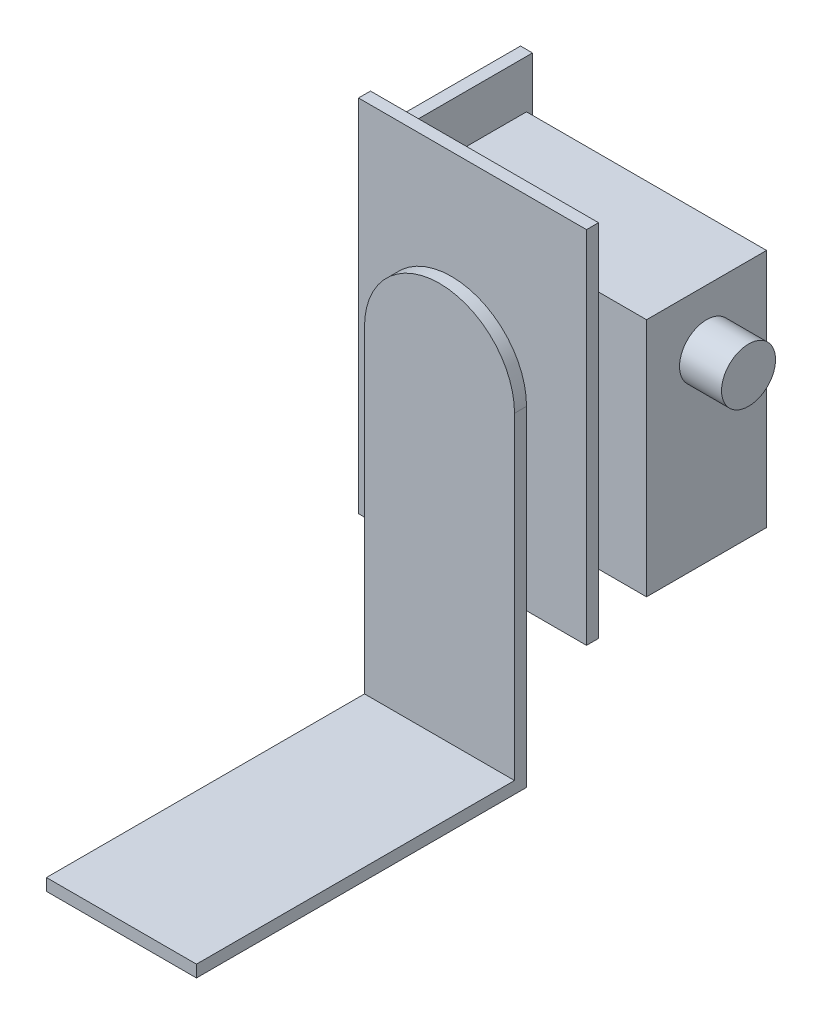
ISO-10303-21;
HEADER;
FILE_DESCRIPTION(('STEP AP214'),'2;1');
FILE_NAME('part.step','',(''),(''),'','','');
FILE_SCHEMA(('AUTOMOTIVE_DESIGN { 1 0 10303 214 1 1 1 1 }'));
ENDSEC;
DATA;
#1=APPLICATION_CONTEXT('core data for automotive mechanical design processes');
#2=APPLICATION_PROTOCOL_DEFINITION('international standard','automotive_design',2000,#1);
#3=PRODUCT_CONTEXT('',#1,'mechanical');
#4=PRODUCT('Part','Part','',(#3));
#5=PRODUCT_RELATED_PRODUCT_CATEGORY('part','',(#4));
#6=PRODUCT_DEFINITION_FORMATION('','',#4);
#7=PRODUCT_DEFINITION_CONTEXT('part definition',#1,'design');
#8=PRODUCT_DEFINITION('design','',#6,#7);
#9=PRODUCT_DEFINITION_SHAPE('','',#8);
#10=(LENGTH_UNIT() NAMED_UNIT(*) SI_UNIT(.MILLI.,.METRE.));
#11=(NAMED_UNIT(*) PLANE_ANGLE_UNIT() SI_UNIT($,.RADIAN.));
#12=(NAMED_UNIT(*) SI_UNIT($,.STERADIAN.) SOLID_ANGLE_UNIT());
#13=UNCERTAINTY_MEASURE_WITH_UNIT(LENGTH_MEASURE(1.E-05),#10,'distance_accuracy_value','');
#14=(GEOMETRIC_REPRESENTATION_CONTEXT(3) GLOBAL_UNCERTAINTY_ASSIGNED_CONTEXT((#13)) GLOBAL_UNIT_ASSIGNED_CONTEXT((#10,
#11,#12)) REPRESENTATION_CONTEXT('',''));
#15=CARTESIAN_POINT('',(0.,0.,0.));
#16=DIRECTION('',(0.,0.,1.));
#17=DIRECTION('',(1.,0.,0.));
#18=AXIS2_PLACEMENT_3D('',#15,#16,#17);
#19=CARTESIAN_POINT('',(0.,0.,-57.));
#20=DIRECTION('',(0.,0.,1.));
#21=DIRECTION('',(1.,0.,0.));
#22=AXIS2_PLACEMENT_3D('',#19,#20,#21);
#23=PLANE('',#22);
#24=DIRECTION('',(1.,0.,0.));
#25=VECTOR('',#24,1.);
#26=CARTESIAN_POINT('',(-2.99999999999998,79.5,-57.));
#27=LINE('',#26,#25);
#28=CARTESIAN_POINT('',(-2.99999999999998,79.5,-57.));
#29=VERTEX_POINT('',#28);
#30=CARTESIAN_POINT('',(-0.999999999999995,79.5,-57.));
#31=VERTEX_POINT('',#30);
#32=EDGE_CURVE('E435',#29,#31,#27,.T.);
#33=ORIENTED_EDGE('',*,*,#32,.F.);
#34=DIRECTION('',(0.,1.,0.));
#35=VECTOR('',#34,1.);
#36=CARTESIAN_POINT('',(-3.,25.5,-57.));
#37=LINE('',#36,#35);
#38=CARTESIAN_POINT('',(-3.,85.5,-57.));
#39=VERTEX_POINT('',#38);
#40=EDGE_CURVE('E190',#29,#39,#37,.T.);
#41=ORIENTED_EDGE('',*,*,#40,.T.);
#42=DIRECTION('',(1.,0.,0.));
#43=VECTOR('',#42,1.);
#44=CARTESIAN_POINT('',(35.,85.5,-57.));
#45=LINE('',#44,#43);
#46=CARTESIAN_POINT('',(35.,85.5,-57.));
#47=VERTEX_POINT('',#46);
#48=EDGE_CURVE('E240',#39,#47,#45,.T.);
#49=ORIENTED_EDGE('',*,*,#48,.T.);
#50=DIRECTION('',(0.,-1.,0.));
#51=VECTOR('',#50,1.);
#52=CARTESIAN_POINT('',(35.,25.5,-57.));
#53=LINE('',#52,#51);
#54=CARTESIAN_POINT('',(35.,75.5,-57.));
#55=VERTEX_POINT('',#54);
#56=EDGE_CURVE('E231',#47,#55,#53,.T.);
#57=ORIENTED_EDGE('',*,*,#56,.T.);
#58=DIRECTION('',(1.,0.,0.));
#59=VECTOR('',#58,1.);
#60=CARTESIAN_POINT('',(43.,75.5,-57.));
#61=LINE('',#60,#59);
#62=CARTESIAN_POINT('',(3.,75.5,-57.));
#63=VERTEX_POINT('',#62);
#64=EDGE_CURVE('E204',#63,#55,#61,.T.);
#65=ORIENTED_EDGE('',*,*,#64,.F.);
#66=DIRECTION('',(0.,1.,0.));
#67=VECTOR('',#66,1.);
#68=CARTESIAN_POINT('',(3.,35.5,-57.));
#69=LINE('',#68,#67);
#70=CARTESIAN_POINT('',(3.,35.5,-57.));
#71=VERTEX_POINT('',#70);
#72=EDGE_CURVE('E213',#71,#63,#69,.T.);
#73=ORIENTED_EDGE('',*,*,#72,.F.);
#74=DIRECTION('',(-1.,0.,0.));
#75=VECTOR('',#74,1.);
#76=CARTESIAN_POINT('',(43.,35.5,-57.));
#77=LINE('',#76,#75);
#78=CARTESIAN_POINT('',(35.,35.5,-57.));
#79=VERTEX_POINT('',#78);
#80=EDGE_CURVE('E40',#79,#71,#77,.T.);
#81=ORIENTED_EDGE('',*,*,#80,.F.);
#82=CARTESIAN_POINT('',(35.,25.5,-57.));
#83=VERTEX_POINT('',#82);
#84=EDGE_CURVE('E236',#79,#83,#53,.T.);
#85=ORIENTED_EDGE('',*,*,#84,.T.);
#86=DIRECTION('',(-1.,0.,0.));
#87=VECTOR('',#86,1.);
#88=CARTESIAN_POINT('',(35.,25.5,-57.));
#89=LINE('',#88,#87);
#90=CARTESIAN_POINT('',(-3.,25.5,-57.));
#91=VERTEX_POINT('',#90);
#92=EDGE_CURVE('E234',#83,#91,#89,.T.);
#93=ORIENTED_EDGE('',*,*,#92,.T.);
#94=CARTESIAN_POINT('',(-3.,39.5,-57.));
#95=VERTEX_POINT('',#94);
#96=EDGE_CURVE('E238',#91,#95,#37,.T.);
#97=ORIENTED_EDGE('',*,*,#96,.T.);
#98=DIRECTION('',(-1.,0.,0.));
#99=VECTOR('',#98,1.);
#100=CARTESIAN_POINT('',(-3.,39.5,-57.));
#101=LINE('',#100,#99);
#102=CARTESIAN_POINT('',(-0.999999999999995,39.5,-57.));
#103=VERTEX_POINT('',#102);
#104=EDGE_CURVE('E52',#103,#95,#101,.T.);
#105=ORIENTED_EDGE('',*,*,#104,.F.);
#106=DIRECTION('',(0.,-1.,0.));
#107=VECTOR('',#106,1.);
#108=CARTESIAN_POINT('',(-0.999999999999995,79.5,-57.));
#109=LINE('',#108,#107);
#110=EDGE_CURVE('E47',#31,#103,#109,.T.);
#111=ORIENTED_EDGE('',*,*,#110,.F.);
#112=EDGE_LOOP('',(#33,#41,#49,#57,#65,#73,#81,#85,#93,#97,#105,#111));
#113=FACE_BOUND('',#112,.T.);
#114=ADVANCED_FACE('F32',(#113),#23,.F.);
#115=CARTESIAN_POINT('',(0.,2.,-55.));
#116=DIRECTION('',(0.,0.,1.));
#117=DIRECTION('',(1.,0.,0.));
#118=AXIS2_PLACEMENT_3D('',#115,#116,#117);
#119=PLANE('',#118);
#120=DIRECTION('',(-1.,0.,0.));
#121=VECTOR('',#120,1.);
#122=CARTESIAN_POINT('',(35.,25.5,-55.));
#123=LINE('',#122,#121);
#124=CARTESIAN_POINT('',(25.,25.5,-55.));
#125=VERTEX_POINT('',#124);
#126=CARTESIAN_POINT('',(0.,25.5,-55.));
#127=VERTEX_POINT('',#126);
#128=EDGE_CURVE('E250',#125,#127,#123,.T.);
#129=ORIENTED_EDGE('',*,*,#128,.F.);
#130=DIRECTION('',(0.,-1.,0.));
#131=VECTOR('',#130,1.);
#132=CARTESIAN_POINT('',(25.,2.,-55.));
#133=LINE('',#132,#131);
#134=CARTESIAN_POINT('',(25.,0.,-55.));
#135=VERTEX_POINT('',#134);
#136=EDGE_CURVE('E306',#125,#135,#133,.T.);
#137=ORIENTED_EDGE('',*,*,#136,.T.);
#138=DIRECTION('',(-1.,0.,0.));
#139=VECTOR('',#138,1.);
#140=CARTESIAN_POINT('',(0.,0.,-55.));
#141=LINE('',#140,#139);
#142=CARTESIAN_POINT('',(0.,0.,-55.));
#143=VERTEX_POINT('',#142);
#144=EDGE_CURVE('E290',#135,#143,#141,.T.);
#145=ORIENTED_EDGE('',*,*,#144,.T.);
#146=DIRECTION('',(0.,-1.,0.));
#147=VECTOR('',#146,1.);
#148=CARTESIAN_POINT('',(0.,2.,-55.));
#149=LINE('',#148,#147);
#150=EDGE_CURVE('E294',#127,#143,#149,.T.);
#151=ORIENTED_EDGE('',*,*,#150,.F.);
#152=EDGE_LOOP('',(#129,#137,#145,#151));
#153=FACE_BOUND('',#152,.T.);
#154=ADVANCED_FACE('F372',(#153),#119,.F.);
#155=CARTESIAN_POINT('',(0.,2.,0.));
#156=DIRECTION('',(0.,-1.,0.));
#157=DIRECTION('',(0.,0.,-1.));
#158=AXIS2_PLACEMENT_3D('',#155,#156,#157);
#159=PLANE('',#158);
#160=DIRECTION('',(1.,0.,0.));
#161=VECTOR('',#160,1.);
#162=CARTESIAN_POINT('',(0.,2.,-53.));
#163=LINE('',#162,#161);
#164=CARTESIAN_POINT('',(0.,2.,-53.));
#165=VERTEX_POINT('',#164);
#166=CARTESIAN_POINT('',(25.,2.,-53.));
#167=VERTEX_POINT('',#166);
#168=EDGE_CURVE('E269',#165,#167,#163,.T.);
#169=ORIENTED_EDGE('',*,*,#168,.F.);
#170=DIRECTION('',(0.,0.,1.));
#171=VECTOR('',#170,1.);
#172=CARTESIAN_POINT('',(0.,2.,0.));
#173=LINE('',#172,#171);
#174=CARTESIAN_POINT('',(0.,2.,0.));
#175=VERTEX_POINT('',#174);
#176=EDGE_CURVE('E287',#165,#175,#173,.T.);
#177=ORIENTED_EDGE('',*,*,#176,.T.);
#178=DIRECTION('',(1.,0.,0.));
#179=VECTOR('',#178,1.);
#180=CARTESIAN_POINT('',(0.,2.,0.));
#181=LINE('',#180,#179);
#182=CARTESIAN_POINT('',(25.,2.,0.));
#183=VERTEX_POINT('',#182);
#184=EDGE_CURVE('E289',#175,#183,#181,.T.);
#185=ORIENTED_EDGE('',*,*,#184,.T.);
#186=DIRECTION('',(0.,0.,-1.));
#187=VECTOR('',#186,1.);
#188=CARTESIAN_POINT('',(25.,2.,0.));
#189=LINE('',#188,#187);
#190=EDGE_CURVE('E292',#183,#167,#189,.T.);
#191=ORIENTED_EDGE('',*,*,#190,.T.);
#192=EDGE_LOOP('',(#169,#177,#185,#191));
#193=FACE_BOUND('',#192,.T.);
#194=ADVANCED_FACE('F377',(#193),#159,.F.);
#195=CARTESIAN_POINT('',(0.,2.,0.));
#196=DIRECTION('',(1.,0.,0.));
#197=DIRECTION('',(0.,0.,-1.));
#198=AXIS2_PLACEMENT_3D('',#195,#196,#197);
#199=PLANE('',#198);
#200=ORIENTED_EDGE('',*,*,#176,.F.);
#201=DIRECTION('',(0.,-1.,0.));
#202=VECTOR('',#201,1.);
#203=CARTESIAN_POINT('',(0.,55.,-53.));
#204=LINE('',#203,#202);
#205=CARTESIAN_POINT('',(0.,55.,-53.));
#206=VERTEX_POINT('',#205);
#207=EDGE_CURVE('E283',#206,#165,#204,.T.);
#208=ORIENTED_EDGE('',*,*,#207,.F.);
#209=DIRECTION('',(0.,0.,1.));
#210=VECTOR('',#209,1.);
#211=CARTESIAN_POINT('',(0.,55.,-55.));
#212=LINE('',#211,#210);
#213=CARTESIAN_POINT('',(0.,55.,-55.));
#214=VERTEX_POINT('',#213);
#215=EDGE_CURVE('E272',#214,#206,#212,.T.);
#216=ORIENTED_EDGE('',*,*,#215,.F.);
#217=EDGE_CURVE('E304',#214,#127,#149,.T.);
#218=ORIENTED_EDGE('',*,*,#217,.T.);
#219=ORIENTED_EDGE('',*,*,#150,.T.);
#220=DIRECTION('',(0.,0.,1.));
#221=VECTOR('',#220,1.);
#222=CARTESIAN_POINT('',(0.,0.,0.));
#223=LINE('',#222,#221);
#224=CARTESIAN_POINT('',(0.,0.,0.));
#225=VERTEX_POINT('',#224);
#226=EDGE_CURVE('E286',#143,#225,#223,.T.);
#227=ORIENTED_EDGE('',*,*,#226,.T.);
#228=DIRECTION('',(0.,-1.,0.));
#229=VECTOR('',#228,1.);
#230=CARTESIAN_POINT('',(0.,2.,0.));
#231=LINE('',#230,#229);
#232=EDGE_CURVE('E312',#175,#225,#231,.T.);
#233=ORIENTED_EDGE('',*,*,#232,.F.);
#234=EDGE_LOOP('',(#200,#208,#216,#218,#219,#227,#233));
#235=FACE_BOUND('',#234,.T.);
#236=ADVANCED_FACE('F34',(#235),#199,.F.);
#237=CARTESIAN_POINT('',(0.,2.,0.));
#238=DIRECTION('',(0.,0.,-1.));
#239=DIRECTION('',(-1.,0.,0.));
#240=AXIS2_PLACEMENT_3D('',#237,#238,#239);
#241=PLANE('',#240);
#242=DIRECTION('',(1.,0.,0.));
#243=VECTOR('',#242,1.);
#244=CARTESIAN_POINT('',(0.,0.,0.));
#245=LINE('',#244,#243);
#246=CARTESIAN_POINT('',(25.,0.,0.));
#247=VERTEX_POINT('',#246);
#248=EDGE_CURVE('E297',#225,#247,#245,.T.);
#249=ORIENTED_EDGE('',*,*,#248,.T.);
#250=DIRECTION('',(0.,-1.,0.));
#251=VECTOR('',#250,1.);
#252=CARTESIAN_POINT('',(25.,2.,0.));
#253=LINE('',#252,#251);
#254=EDGE_CURVE('E310',#183,#247,#253,.T.);
#255=ORIENTED_EDGE('',*,*,#254,.F.);
#256=ORIENTED_EDGE('',*,*,#184,.F.);
#257=ORIENTED_EDGE('',*,*,#232,.T.);
#258=EDGE_LOOP('',(#249,#255,#256,#257));
#259=FACE_BOUND('',#258,.T.);
#260=ADVANCED_FACE('F410',(#259),#241,.F.);
#261=CARTESIAN_POINT('',(25.,2.,0.));
#262=DIRECTION('',(-1.,0.,0.));
#263=DIRECTION('',(0.,0.,1.));
#264=AXIS2_PLACEMENT_3D('',#261,#262,#263);
#265=PLANE('',#264);
#266=DIRECTION('',(0.,0.,-1.));
#267=VECTOR('',#266,1.);
#268=CARTESIAN_POINT('',(25.,0.,0.));
#269=LINE('',#268,#267);
#270=EDGE_CURVE('E299',#247,#135,#269,.T.);
#271=ORIENTED_EDGE('',*,*,#270,.T.);
#272=ORIENTED_EDGE('',*,*,#136,.F.);
#273=CARTESIAN_POINT('',(25.,55.,-55.));
#274=VERTEX_POINT('',#273);
#275=EDGE_CURVE('E307',#274,#125,#133,.T.);
#276=ORIENTED_EDGE('',*,*,#275,.F.);
#277=DIRECTION('',(0.,0.,-1.));
#278=VECTOR('',#277,1.);
#279=CARTESIAN_POINT('',(25.,55.,-55.));
#280=LINE('',#279,#278);
#281=CARTESIAN_POINT('',(25.,55.,-53.));
#282=VERTEX_POINT('',#281);
#283=EDGE_CURVE('E275',#282,#274,#280,.T.);
#284=ORIENTED_EDGE('',*,*,#283,.F.);
#285=DIRECTION('',(0.,-1.,0.));
#286=VECTOR('',#285,1.);
#287=CARTESIAN_POINT('',(25.,55.,-53.));
#288=LINE('',#287,#286);
#289=EDGE_CURVE('E278',#282,#167,#288,.T.);
#290=ORIENTED_EDGE('',*,*,#289,.T.);
#291=ORIENTED_EDGE('',*,*,#190,.F.);
#292=ORIENTED_EDGE('',*,*,#254,.T.);
#293=EDGE_LOOP('',(#271,#272,#276,#284,#290,#291,#292));
#294=FACE_BOUND('',#293,.T.);
#295=ADVANCED_FACE('F406',(#294),#265,.F.);
#296=CARTESIAN_POINT('',(0.,0.,0.));
#297=DIRECTION('',(0.,-1.,0.));
#298=DIRECTION('',(0.,0.,-1.));
#299=AXIS2_PLACEMENT_3D('',#296,#297,#298);
#300=PLANE('',#299);
#301=ORIENTED_EDGE('',*,*,#226,.F.);
#302=ORIENTED_EDGE('',*,*,#144,.F.);
#303=ORIENTED_EDGE('',*,*,#270,.F.);
#304=ORIENTED_EDGE('',*,*,#248,.F.);
#305=EDGE_LOOP('',(#301,#302,#303,#304));
#306=FACE_BOUND('',#305,.T.);
#307=ADVANCED_FACE('F400',(#306),#300,.T.);
#308=CARTESIAN_POINT('',(0.,55.,-53.));
#309=DIRECTION('',(0.,0.,-1.));
#310=DIRECTION('',(-1.,0.,0.));
#311=AXIS2_PLACEMENT_3D('',#308,#309,#310);
#312=PLANE('',#311);
#313=ORIENTED_EDGE('',*,*,#168,.T.);
#314=ORIENTED_EDGE('',*,*,#289,.F.);
#315=CARTESIAN_POINT('',(12.5,55.,-53.));
#316=DIRECTION('',(0.,0.,1.));
#317=DIRECTION('',(-1.,0.,0.));
#318=AXIS2_PLACEMENT_3D('',#315,#316,#317);
#319=CIRCLE('',#318,12.5);
#320=EDGE_CURVE('E265',#282,#206,#319,.T.);
#321=ORIENTED_EDGE('',*,*,#320,.T.);
#322=ORIENTED_EDGE('',*,*,#207,.T.);
#323=EDGE_LOOP('',(#313,#314,#321,#322));
#324=FACE_BOUND('',#323,.T.);
#325=ADVANCED_FACE('F396',(#324),#312,.F.);
#326=CARTESIAN_POINT('',(12.5,55.,-55.));
#327=DIRECTION('',(0.,0.,1.));
#328=DIRECTION('',(1.,0.,0.));
#329=AXIS2_PLACEMENT_3D('',#326,#327,#328);
#330=CYLINDRICAL_SURFACE('',#329,12.5);
#331=ORIENTED_EDGE('',*,*,#320,.F.);
#332=ORIENTED_EDGE('',*,*,#283,.T.);
#333=CARTESIAN_POINT('',(12.5,55.,-55.));
#334=DIRECTION('',(0.,0.,1.));
#335=DIRECTION('',(-1.,0.,0.));
#336=AXIS2_PLACEMENT_3D('',#333,#334,#335);
#337=CIRCLE('',#336,12.5);
#338=EDGE_CURVE('E266',#274,#214,#337,.T.);
#339=ORIENTED_EDGE('',*,*,#338,.T.);
#340=ORIENTED_EDGE('',*,*,#215,.T.);
#341=EDGE_LOOP('',(#331,#332,#339,#340));
#342=FACE_BOUND('',#341,.T.);
#343=ADVANCED_FACE('F385',(#342),#330,.T.);
#344=CARTESIAN_POINT('',(0.,0.,-55.));
#345=DIRECTION('',(0.,0.,1.));
#346=DIRECTION('',(1.,0.,0.));
#347=AXIS2_PLACEMENT_3D('',#344,#345,#346);
#348=PLANE('',#347);
#349=ORIENTED_EDGE('',*,*,#217,.F.);
#350=ORIENTED_EDGE('',*,*,#338,.F.);
#351=ORIENTED_EDGE('',*,*,#275,.T.);
#352=CARTESIAN_POINT('',(35.,25.5,-55.));
#353=VERTEX_POINT('',#352);
#354=EDGE_CURVE('E246',#353,#125,#123,.T.);
#355=ORIENTED_EDGE('',*,*,#354,.F.);
#356=DIRECTION('',(0.,-1.,0.));
#357=VECTOR('',#356,1.);
#358=CARTESIAN_POINT('',(35.,25.5,-55.));
#359=LINE('',#358,#357);
#360=CARTESIAN_POINT('',(35.,85.5,-55.));
#361=VERTEX_POINT('',#360);
#362=EDGE_CURVE('E230',#361,#353,#359,.T.);
#363=ORIENTED_EDGE('',*,*,#362,.F.);
#364=DIRECTION('',(1.,0.,0.));
#365=VECTOR('',#364,1.);
#366=CARTESIAN_POINT('',(35.,85.5,-55.));
#367=LINE('',#366,#365);
#368=CARTESIAN_POINT('',(-3.,85.5,-55.));
#369=VERTEX_POINT('',#368);
#370=EDGE_CURVE('E252',#369,#361,#367,.T.);
#371=ORIENTED_EDGE('',*,*,#370,.F.);
#372=DIRECTION('',(0.,1.,0.));
#373=VECTOR('',#372,1.);
#374=CARTESIAN_POINT('',(-3.,25.5,-55.));
#375=LINE('',#374,#373);
#376=CARTESIAN_POINT('',(-3.,25.5,-55.));
#377=VERTEX_POINT('',#376);
#378=EDGE_CURVE('E249',#377,#369,#375,.T.);
#379=ORIENTED_EDGE('',*,*,#378,.F.);
#380=EDGE_CURVE('E245',#127,#377,#123,.T.);
#381=ORIENTED_EDGE('',*,*,#380,.F.);
#382=EDGE_LOOP('',(#349,#350,#351,#355,#363,#371,#379,#381));
#383=FACE_BOUND('',#382,.T.);
#384=ADVANCED_FACE('F329',(#383),#348,.T.);
#385=CARTESIAN_POINT('',(35.,25.5,-57.));
#386=DIRECTION('',(-1.,0.,0.));
#387=DIRECTION('',(0.,0.,1.));
#388=AXIS2_PLACEMENT_3D('',#385,#386,#387);
#389=PLANE('',#388);
#390=ORIENTED_EDGE('',*,*,#362,.T.);
#391=DIRECTION('',(0.,0.,1.));
#392=VECTOR('',#391,1.);
#393=CARTESIAN_POINT('',(35.,25.5,-57.));
#394=LINE('',#393,#392);
#395=EDGE_CURVE('E262',#83,#353,#394,.T.);
#396=ORIENTED_EDGE('',*,*,#395,.F.);
#397=ORIENTED_EDGE('',*,*,#84,.F.);
#398=EDGE_CURVE('E235',#55,#79,#53,.T.);
#399=ORIENTED_EDGE('',*,*,#398,.F.);
#400=ORIENTED_EDGE('',*,*,#56,.F.);
#401=DIRECTION('',(0.,0.,1.));
#402=VECTOR('',#401,1.);
#403=CARTESIAN_POINT('',(35.,85.5,-57.));
#404=LINE('',#403,#402);
#405=EDGE_CURVE('E242',#47,#361,#404,.T.);
#406=ORIENTED_EDGE('',*,*,#405,.T.);
#407=EDGE_LOOP('',(#390,#396,#397,#399,#400,#406));
#408=FACE_BOUND('',#407,.T.);
#409=ADVANCED_FACE('F337',(#408),#389,.F.);
#410=CARTESIAN_POINT('',(35.,25.5,-57.));
#411=DIRECTION('',(0.,1.,0.));
#412=DIRECTION('',(0.,0.,1.));
#413=AXIS2_PLACEMENT_3D('',#410,#411,#412);
#414=PLANE('',#413);
#415=ORIENTED_EDGE('',*,*,#354,.T.);
#416=ORIENTED_EDGE('',*,*,#128,.T.);
#417=ORIENTED_EDGE('',*,*,#380,.T.);
#418=DIRECTION('',(0.,0.,1.));
#419=VECTOR('',#418,1.);
#420=CARTESIAN_POINT('',(-3.,25.5,-57.));
#421=LINE('',#420,#419);
#422=EDGE_CURVE('E259',#91,#377,#421,.T.);
#423=ORIENTED_EDGE('',*,*,#422,.F.);
#424=ORIENTED_EDGE('',*,*,#92,.F.);
#425=ORIENTED_EDGE('',*,*,#395,.T.);
#426=EDGE_LOOP('',(#415,#416,#417,#423,#424,#425));
#427=FACE_BOUND('',#426,.T.);
#428=ADVANCED_FACE('F322',(#427),#414,.F.);
#429=CARTESIAN_POINT('',(-3.,25.5,-57.));
#430=DIRECTION('',(1.,0.,0.));
#431=DIRECTION('',(0.,0.,-1.));
#432=AXIS2_PLACEMENT_3D('',#429,#430,#431);
#433=PLANE('',#432);
#434=ORIENTED_EDGE('',*,*,#378,.T.);
#435=DIRECTION('',(0.,0.,1.));
#436=VECTOR('',#435,1.);
#437=CARTESIAN_POINT('',(-3.,85.5,-57.));
#438=LINE('',#437,#436);
#439=EDGE_CURVE('E256',#39,#369,#438,.T.);
#440=ORIENTED_EDGE('',*,*,#439,.F.);
#441=ORIENTED_EDGE('',*,*,#40,.F.);
#442=DIRECTION('',(0.,0.,1.));
#443=VECTOR('',#442,1.);
#444=CARTESIAN_POINT('',(-2.99999999999998,79.5,-82.));
#445=LINE('',#444,#443);
#446=CARTESIAN_POINT('',(-2.99999999999998,79.5,-82.));
#447=VERTEX_POINT('',#446);
#448=EDGE_CURVE('E172',#447,#29,#445,.T.);
#449=ORIENTED_EDGE('',*,*,#448,.F.);
#450=DIRECTION('',(0.,1.,0.));
#451=VECTOR('',#450,1.);
#452=CARTESIAN_POINT('',(-2.99999999999998,79.5,-82.));
#453=LINE('',#452,#451);
#454=CARTESIAN_POINT('',(-3.,39.5,-82.));
#455=VERTEX_POINT('',#454);
#456=EDGE_CURVE('E178',#455,#447,#453,.T.);
#457=ORIENTED_EDGE('',*,*,#456,.F.);
#458=DIRECTION('',(0.,0.,1.));
#459=VECTOR('',#458,1.);
#460=CARTESIAN_POINT('',(-3.,39.5,-82.));
#461=LINE('',#460,#459);
#462=EDGE_CURVE('E428',#455,#95,#461,.T.);
#463=ORIENTED_EDGE('',*,*,#462,.T.);
#464=ORIENTED_EDGE('',*,*,#96,.F.);
#465=ORIENTED_EDGE('',*,*,#422,.T.);
#466=EDGE_LOOP('',(#434,#440,#441,#449,#457,#463,#464,#465));
#467=FACE_BOUND('',#466,.T.);
#468=ADVANCED_FACE('F188',(#467),#433,.F.);
#469=CARTESIAN_POINT('',(35.,85.5,-57.));
#470=DIRECTION('',(0.,-1.,0.));
#471=DIRECTION('',(0.,0.,-1.));
#472=AXIS2_PLACEMENT_3D('',#469,#470,#471);
#473=PLANE('',#472);
#474=ORIENTED_EDGE('',*,*,#370,.T.);
#475=ORIENTED_EDGE('',*,*,#405,.F.);
#476=ORIENTED_EDGE('',*,*,#48,.F.);
#477=ORIENTED_EDGE('',*,*,#439,.T.);
#478=EDGE_LOOP('',(#474,#475,#476,#477));
#479=FACE_BOUND('',#478,.T.);
#480=ADVANCED_FACE('F333',(#479),#473,.F.);
#481=CARTESIAN_POINT('',(43.,35.5,-77.));
#482=DIRECTION('',(-1.,0.,0.));
#483=DIRECTION('',(0.,0.,1.));
#484=AXIS2_PLACEMENT_3D('',#481,#482,#483);
#485=PLANE('',#484);
#486=CARTESIAN_POINT('',(43.,66.,-67.));
#487=DIRECTION('',(-1.,0.,0.));
#488=DIRECTION('',(0.,0.,1.));
#489=AXIS2_PLACEMENT_3D('',#486,#487,#488);
#490=CIRCLE('',#489,4.50000000000001);
#491=CARTESIAN_POINT('',(43.,66.,-62.5));
#492=VERTEX_POINT('',#491);
#493=EDGE_CURVE('E11',#492,#492,#490,.F.);
#494=ORIENTED_EDGE('',*,*,#493,.F.);
#495=EDGE_LOOP('',(#494));
#496=FACE_BOUND('',#495,.T.);
#497=DIRECTION('',(0.,-1.,0.));
#498=VECTOR('',#497,1.);
#499=CARTESIAN_POINT('',(43.,35.5,-57.));
#500=LINE('',#499,#498);
#501=CARTESIAN_POINT('',(43.,75.5,-57.));
#502=VERTEX_POINT('',#501);
#503=CARTESIAN_POINT('',(43.,35.5,-57.));
#504=VERTEX_POINT('',#503);
#505=EDGE_CURVE('E191',#502,#504,#500,.T.);
#506=ORIENTED_EDGE('',*,*,#505,.T.);
#507=DIRECTION('',(0.,0.,1.));
#508=VECTOR('',#507,1.);
#509=CARTESIAN_POINT('',(43.,35.5,-77.));
#510=LINE('',#509,#508);
#511=CARTESIAN_POINT('',(43.,35.5,-77.));
#512=VERTEX_POINT('',#511);
#513=EDGE_CURVE('E227',#512,#504,#510,.T.);
#514=ORIENTED_EDGE('',*,*,#513,.F.);
#515=DIRECTION('',(0.,-1.,0.));
#516=VECTOR('',#515,1.);
#517=CARTESIAN_POINT('',(43.,35.5,-77.));
#518=LINE('',#517,#516);
#519=CARTESIAN_POINT('',(43.,75.5,-77.));
#520=VERTEX_POINT('',#519);
#521=EDGE_CURVE('E200',#520,#512,#518,.T.);
#522=ORIENTED_EDGE('',*,*,#521,.F.);
#523=DIRECTION('',(0.,0.,1.));
#524=VECTOR('',#523,1.);
#525=CARTESIAN_POINT('',(43.,75.5,-77.));
#526=LINE('',#525,#524);
#527=EDGE_CURVE('E209',#520,#502,#526,.T.);
#528=ORIENTED_EDGE('',*,*,#527,.T.);
#529=EDGE_LOOP('',(#506,#514,#522,#528));
#530=FACE_BOUND('',#529,.T.);
#531=ADVANCED_FACE('F359',(#496,#530),#485,.F.);
#532=CARTESIAN_POINT('',(43.,35.5,-77.));
#533=DIRECTION('',(0.,1.,0.));
#534=DIRECTION('',(0.,0.,1.));
#535=AXIS2_PLACEMENT_3D('',#532,#533,#534);
#536=PLANE('',#535);
#537=EDGE_CURVE('E194',#504,#79,#77,.T.);
#538=ORIENTED_EDGE('',*,*,#537,.T.);
#539=ORIENTED_EDGE('',*,*,#80,.T.);
#540=DIRECTION('',(0.,0.,1.));
#541=VECTOR('',#540,1.);
#542=CARTESIAN_POINT('',(3.,35.5,-77.));
#543=LINE('',#542,#541);
#544=CARTESIAN_POINT('',(3.,35.5,-77.));
#545=VERTEX_POINT('',#544);
#546=EDGE_CURVE('E224',#545,#71,#543,.T.);
#547=ORIENTED_EDGE('',*,*,#546,.F.);
#548=DIRECTION('',(-1.,0.,0.));
#549=VECTOR('',#548,1.);
#550=CARTESIAN_POINT('',(43.,35.5,-77.));
#551=LINE('',#550,#549);
#552=EDGE_CURVE('E203',#512,#545,#551,.T.);
#553=ORIENTED_EDGE('',*,*,#552,.F.);
#554=ORIENTED_EDGE('',*,*,#513,.T.);
#555=EDGE_LOOP('',(#538,#539,#547,#553,#554));
#556=FACE_BOUND('',#555,.T.);
#557=ADVANCED_FACE('F355',(#556),#536,.F.);
#558=CARTESIAN_POINT('',(3.,35.5,-77.));
#559=DIRECTION('',(1.,0.,0.));
#560=DIRECTION('',(0.,0.,-1.));
#561=AXIS2_PLACEMENT_3D('',#558,#559,#560);
#562=PLANE('',#561);
#563=ORIENTED_EDGE('',*,*,#72,.T.);
#564=DIRECTION('',(0.,0.,1.));
#565=VECTOR('',#564,1.);
#566=CARTESIAN_POINT('',(3.,75.5,-77.));
#567=LINE('',#566,#565);
#568=CARTESIAN_POINT('',(3.,75.5,-77.));
#569=VERTEX_POINT('',#568);
#570=EDGE_CURVE('E221',#569,#63,#567,.T.);
#571=ORIENTED_EDGE('',*,*,#570,.F.);
#572=DIRECTION('',(0.,1.,0.));
#573=VECTOR('',#572,1.);
#574=CARTESIAN_POINT('',(3.,35.5,-77.));
#575=LINE('',#574,#573);
#576=EDGE_CURVE('E206',#545,#569,#575,.T.);
#577=ORIENTED_EDGE('',*,*,#576,.F.);
#578=ORIENTED_EDGE('',*,*,#546,.T.);
#579=EDGE_LOOP('',(#563,#571,#577,#578));
#580=FACE_BOUND('',#579,.T.);
#581=ADVANCED_FACE('F352',(#580),#562,.F.);
#582=CARTESIAN_POINT('',(43.,75.5,-77.));
#583=DIRECTION('',(0.,-1.,0.));
#584=DIRECTION('',(0.,0.,-1.));
#585=AXIS2_PLACEMENT_3D('',#582,#583,#584);
#586=PLANE('',#585);
#587=ORIENTED_EDGE('',*,*,#64,.T.);
#588=EDGE_CURVE('E216',#55,#502,#61,.T.);
#589=ORIENTED_EDGE('',*,*,#588,.T.);
#590=ORIENTED_EDGE('',*,*,#527,.F.);
#591=DIRECTION('',(1.,0.,0.));
#592=VECTOR('',#591,1.);
#593=CARTESIAN_POINT('',(43.,75.5,-77.));
#594=LINE('',#593,#592);
#595=EDGE_CURVE('E208',#569,#520,#594,.T.);
#596=ORIENTED_EDGE('',*,*,#595,.F.);
#597=ORIENTED_EDGE('',*,*,#570,.T.);
#598=EDGE_LOOP('',(#587,#589,#590,#596,#597));
#599=FACE_BOUND('',#598,.T.);
#600=ADVANCED_FACE('F347',(#599),#586,.F.);
#601=CARTESIAN_POINT('',(0.,0.,-77.));
#602=DIRECTION('',(0.,0.,1.));
#603=DIRECTION('',(1.,0.,0.));
#604=AXIS2_PLACEMENT_3D('',#601,#602,#603);
#605=PLANE('',#604);
#606=ORIENTED_EDGE('',*,*,#521,.T.);
#607=ORIENTED_EDGE('',*,*,#552,.T.);
#608=ORIENTED_EDGE('',*,*,#576,.T.);
#609=ORIENTED_EDGE('',*,*,#595,.T.);
#610=EDGE_LOOP('',(#606,#607,#608,#609));
#611=FACE_BOUND('',#610,.T.);
#612=ADVANCED_FACE('F361',(#611),#605,.F.);
#613=CARTESIAN_POINT('',(0.,0.,-57.));
#614=DIRECTION('',(0.,0.,1.));
#615=DIRECTION('',(1.,0.,0.));
#616=AXIS2_PLACEMENT_3D('',#613,#614,#615);
#617=PLANE('',#616);
#618=ORIENTED_EDGE('',*,*,#588,.F.);
#619=ORIENTED_EDGE('',*,*,#398,.T.);
#620=ORIENTED_EDGE('',*,*,#537,.F.);
#621=ORIENTED_EDGE('',*,*,#505,.F.);
#622=EDGE_LOOP('',(#618,#619,#620,#621));
#623=FACE_BOUND('',#622,.T.);
#624=ADVANCED_FACE('F344',(#623),#617,.T.);
#625=CARTESIAN_POINT('',(-2.99999999999998,79.5,-82.));
#626=DIRECTION('',(0.,-1.,0.));
#627=DIRECTION('',(0.,0.,-1.));
#628=AXIS2_PLACEMENT_3D('',#625,#626,#627);
#629=PLANE('',#628);
#630=ORIENTED_EDGE('',*,*,#32,.T.);
#631=DIRECTION('',(0.,0.,1.));
#632=VECTOR('',#631,1.);
#633=CARTESIAN_POINT('',(-0.999999999999995,79.5,-82.));
#634=LINE('',#633,#632);
#635=CARTESIAN_POINT('',(-0.999999999999995,79.5,-82.));
#636=VERTEX_POINT('',#635);
#637=EDGE_CURVE('E174',#636,#31,#634,.T.);
#638=ORIENTED_EDGE('',*,*,#637,.F.);
#639=DIRECTION('',(1.,0.,0.));
#640=VECTOR('',#639,1.);
#641=CARTESIAN_POINT('',(-2.99999999999998,79.5,-82.));
#642=LINE('',#641,#640);
#643=EDGE_CURVE('E168',#447,#636,#642,.T.);
#644=ORIENTED_EDGE('',*,*,#643,.F.);
#645=ORIENTED_EDGE('',*,*,#448,.T.);
#646=EDGE_LOOP('',(#630,#638,#644,#645));
#647=FACE_BOUND('',#646,.T.);
#648=ADVANCED_FACE('F170',(#647),#629,.F.);
#649=CARTESIAN_POINT('',(-0.999999999999995,79.5,-82.));
#650=DIRECTION('',(-1.,0.,0.));
#651=DIRECTION('',(0.,-1.,0.));
#652=AXIS2_PLACEMENT_3D('',#649,#650,#651);
#653=PLANE('',#652);
#654=ORIENTED_EDGE('',*,*,#110,.T.);
#655=DIRECTION('',(0.,0.,1.));
#656=VECTOR('',#655,1.);
#657=CARTESIAN_POINT('',(-0.999999999999995,39.5,-82.));
#658=LINE('',#657,#656);
#659=CARTESIAN_POINT('',(-0.999999999999995,39.5,-82.));
#660=VERTEX_POINT('',#659);
#661=EDGE_CURVE('E196',#660,#103,#658,.T.);
#662=ORIENTED_EDGE('',*,*,#661,.F.);
#663=DIRECTION('',(0.,-1.,0.));
#664=VECTOR('',#663,1.);
#665=CARTESIAN_POINT('',(-0.999999999999995,79.5,-82.));
#666=LINE('',#665,#664);
#667=EDGE_CURVE('E177',#636,#660,#666,.T.);
#668=ORIENTED_EDGE('',*,*,#667,.F.);
#669=ORIENTED_EDGE('',*,*,#637,.T.);
#670=EDGE_LOOP('',(#654,#662,#668,#669));
#671=FACE_BOUND('',#670,.T.);
#672=ADVANCED_FACE('F494',(#671),#653,.F.);
#673=CARTESIAN_POINT('',(-3.,39.5,-82.));
#674=DIRECTION('',(0.,1.,0.));
#675=DIRECTION('',(0.,0.,1.));
#676=AXIS2_PLACEMENT_3D('',#673,#674,#675);
#677=PLANE('',#676);
#678=ORIENTED_EDGE('',*,*,#104,.T.);
#679=ORIENTED_EDGE('',*,*,#462,.F.);
#680=DIRECTION('',(-1.,0.,0.));
#681=VECTOR('',#680,1.);
#682=CARTESIAN_POINT('',(-3.,39.5,-82.));
#683=LINE('',#682,#681);
#684=EDGE_CURVE('E183',#660,#455,#683,.T.);
#685=ORIENTED_EDGE('',*,*,#684,.F.);
#686=ORIENTED_EDGE('',*,*,#661,.T.);
#687=EDGE_LOOP('',(#678,#679,#685,#686));
#688=FACE_BOUND('',#687,.T.);
#689=ADVANCED_FACE('F427',(#688),#677,.F.);
#690=CARTESIAN_POINT('',(0.,0.,-82.));
#691=DIRECTION('',(0.,0.,1.));
#692=DIRECTION('',(1.,0.,0.));
#693=AXIS2_PLACEMENT_3D('',#690,#691,#692);
#694=PLANE('',#693);
#695=ORIENTED_EDGE('',*,*,#456,.T.);
#696=ORIENTED_EDGE('',*,*,#643,.T.);
#697=ORIENTED_EDGE('',*,*,#667,.T.);
#698=ORIENTED_EDGE('',*,*,#684,.T.);
#699=EDGE_LOOP('',(#695,#696,#697,#698));
#700=FACE_BOUND('',#699,.T.);
#701=ADVANCED_FACE('F181',(#700),#694,.F.);
#702=CARTESIAN_POINT('',(50.,66.,-67.));
#703=DIRECTION('',(-1.,0.,0.));
#704=DIRECTION('',(0.,0.,1.));
#705=AXIS2_PLACEMENT_3D('',#702,#703,#704);
#706=CYLINDRICAL_SURFACE('',#705,4.50000000000001);
#707=CARTESIAN_POINT('',(50.,66.,-67.));
#708=DIRECTION('',(1.,0.,0.));
#709=DIRECTION('',(0.,0.,-1.));
#710=AXIS2_PLACEMENT_3D('',#707,#708,#709);
#711=CIRCLE('',#710,4.50000000000001);
#712=CARTESIAN_POINT('',(50.,66.,-71.5));
#713=VERTEX_POINT('',#712);
#714=EDGE_CURVE('E436',#713,#713,#711,.T.);
#715=ORIENTED_EDGE('',*,*,#714,.F.);
#716=EDGE_LOOP('',(#715));
#717=FACE_BOUND('',#716,.T.);
#718=ORIENTED_EDGE('',*,*,#493,.T.);
#719=EDGE_LOOP('',(#718));
#720=FACE_BOUND('',#719,.T.);
#721=ADVANCED_FACE('F444',(#717,#720),#706,.T.);
#722=CARTESIAN_POINT('',(50.,66.,-67.));
#723=DIRECTION('',(1.,0.,0.));
#724=DIRECTION('',(0.,0.,-1.));
#725=AXIS2_PLACEMENT_3D('',#722,#723,#724);
#726=PLANE('',#725);
#727=ORIENTED_EDGE('',*,*,#714,.T.);
#728=EDGE_LOOP('',(#727));
#729=FACE_BOUND('',#728,.T.);
#730=ADVANCED_FACE('F442',(#729),#726,.T.);
#731=CLOSED_SHELL('',(#114,#154,#194,#236,#260,#295,#307,#325,#343,#384,#409,#428,#468,#480,
#531,#557,#581,#600,#612,#624,#648,#672,#689,#701,#721,#730));
#732=MANIFOLD_SOLID_BREP('B2',#731);
#733=ADVANCED_BREP_SHAPE_REPRESENTATION('',(#18,#732),#14);
#734=SHAPE_DEFINITION_REPRESENTATION(#9,#733);
ENDSEC;
END-ISO-10303-21;
